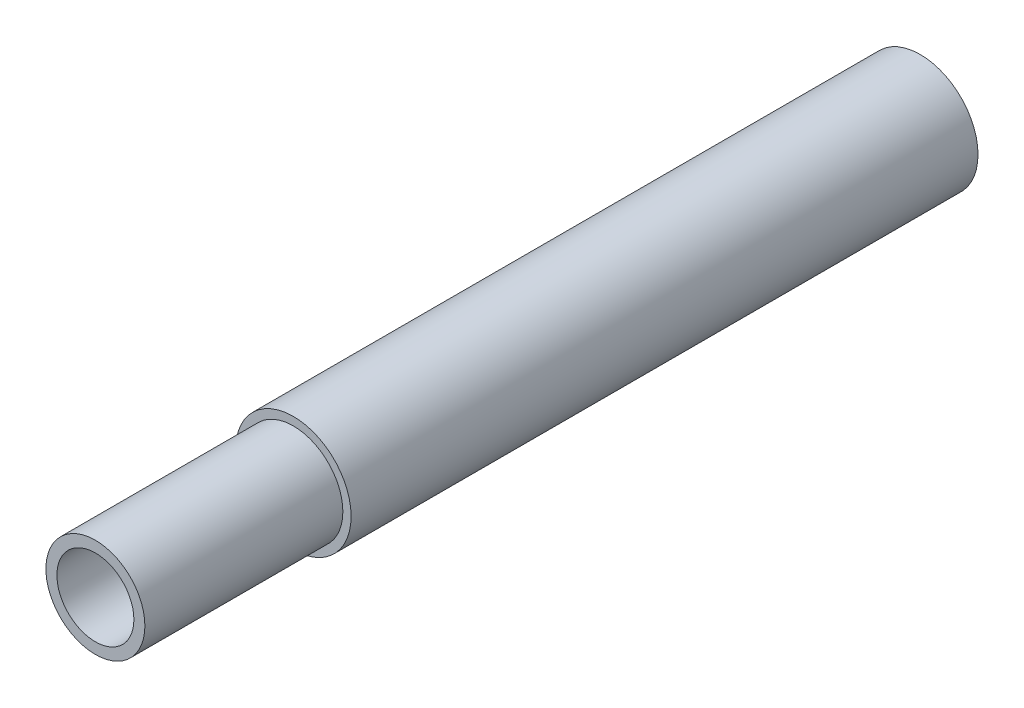
ISO-10303-21;
HEADER;
FILE_DESCRIPTION(('STEP AP214'),'2;1');
FILE_NAME('part.step','',(''),(''),'','','');
FILE_SCHEMA(('AUTOMOTIVE_DESIGN { 1 0 10303 214 1 1 1 1 }'));
ENDSEC;
DATA;
#1=APPLICATION_CONTEXT('core data for automotive mechanical design processes');
#2=APPLICATION_PROTOCOL_DEFINITION('international standard','automotive_design',2000,#1);
#3=PRODUCT_CONTEXT('',#1,'mechanical');
#4=PRODUCT('Part','Part','',(#3));
#5=PRODUCT_RELATED_PRODUCT_CATEGORY('part','',(#4));
#6=PRODUCT_DEFINITION_FORMATION('','',#4);
#7=PRODUCT_DEFINITION_CONTEXT('part definition',#1,'design');
#8=PRODUCT_DEFINITION('design','',#6,#7);
#9=PRODUCT_DEFINITION_SHAPE('','',#8);
#10=(LENGTH_UNIT() NAMED_UNIT(*) SI_UNIT(.MILLI.,.METRE.));
#11=(NAMED_UNIT(*) PLANE_ANGLE_UNIT() SI_UNIT($,.RADIAN.));
#12=(NAMED_UNIT(*) SI_UNIT($,.STERADIAN.) SOLID_ANGLE_UNIT());
#13=UNCERTAINTY_MEASURE_WITH_UNIT(LENGTH_MEASURE(1.E-05),#10,'distance_accuracy_value','');
#14=(GEOMETRIC_REPRESENTATION_CONTEXT(3) GLOBAL_UNCERTAINTY_ASSIGNED_CONTEXT((#13)) GLOBAL_UNIT_ASSIGNED_CONTEXT((#10,
#11,#12)) REPRESENTATION_CONTEXT('',''));
#15=CARTESIAN_POINT('',(0.,0.,0.));
#16=DIRECTION('',(0.,0.,1.));
#17=DIRECTION('',(1.,0.,0.));
#18=AXIS2_PLACEMENT_3D('',#15,#16,#17);
#19=CARTESIAN_POINT('',(0.,0.,-114.));
#20=DIRECTION('',(0.,0.,1.));
#21=DIRECTION('',(1.,0.,0.));
#22=AXIS2_PLACEMENT_3D('',#19,#20,#21);
#23=CYLINDRICAL_SURFACE('',#22,10.5);
#24=CARTESIAN_POINT('',(0.,0.,-114.));
#25=DIRECTION('',(0.,0.,1.));
#26=DIRECTION('',(1.,0.,0.));
#27=AXIS2_PLACEMENT_3D('',#24,#25,#26);
#28=CIRCLE('',#27,10.5);
#29=CARTESIAN_POINT('',(10.5,0.,-114.));
#30=VERTEX_POINT('',#29);
#31=EDGE_CURVE('E46',#30,#30,#28,.T.);
#32=CARTESIAN_POINT('',(0.,0.,0.));
#33=DIRECTION('',(0.,0.,1.));
#34=DIRECTION('',(1.,0.,0.));
#35=AXIS2_PLACEMENT_3D('',#32,#33,#34);
#36=CIRCLE('',#35,10.5);
#37=CARTESIAN_POINT('',(10.5,0.,0.));
#38=VERTEX_POINT('',#37);
#39=EDGE_CURVE('E45',#38,#38,#36,.T.);
#40=CARTESIAN_POINT('',(10.5,0.,-114.));
#41=CARTESIAN_POINT('',(10.5,0.,-112.8125));
#42=CARTESIAN_POINT('',(10.5,0.,-111.625));
#43=CARTESIAN_POINT('',(10.5,0.,-109.25));
#44=CARTESIAN_POINT('',(10.5,0.,-108.0625));
#45=CARTESIAN_POINT('',(10.5,0.,-105.6875));
#46=CARTESIAN_POINT('',(10.5,0.,-104.5));
#47=CARTESIAN_POINT('',(10.5,0.,-102.125));
#48=CARTESIAN_POINT('',(10.5,0.,-100.9375));
#49=CARTESIAN_POINT('',(10.5,0.,-98.5625));
#50=CARTESIAN_POINT('',(10.5,0.,-97.375));
#51=CARTESIAN_POINT('',(10.5,0.,-95.));
#52=CARTESIAN_POINT('',(10.5,0.,-93.8125));
#53=CARTESIAN_POINT('',(10.5,0.,-91.4375));
#54=CARTESIAN_POINT('',(10.5,0.,-90.25));
#55=CARTESIAN_POINT('',(10.5,0.,-87.875));
#56=CARTESIAN_POINT('',(10.5,0.,-86.6875));
#57=CARTESIAN_POINT('',(10.5,0.,-84.3125));
#58=CARTESIAN_POINT('',(10.5,0.,-83.125));
#59=CARTESIAN_POINT('',(10.5,0.,-80.75));
#60=CARTESIAN_POINT('',(10.5,0.,-79.5625));
#61=CARTESIAN_POINT('',(10.5,0.,-77.1875));
#62=CARTESIAN_POINT('',(10.5,0.,-76.));
#63=CARTESIAN_POINT('',(10.5,0.,-73.625));
#64=CARTESIAN_POINT('',(10.5,0.,-72.4375));
#65=CARTESIAN_POINT('',(10.5,0.,-70.0625));
#66=CARTESIAN_POINT('',(10.5,0.,-68.875));
#67=CARTESIAN_POINT('',(10.5,0.,-66.5));
#68=CARTESIAN_POINT('',(10.5,0.,-65.3125));
#69=CARTESIAN_POINT('',(10.5,0.,-62.9375));
#70=CARTESIAN_POINT('',(10.5,0.,-61.75));
#71=CARTESIAN_POINT('',(10.5,0.,-59.375));
#72=CARTESIAN_POINT('',(10.5,0.,-58.1875));
#73=CARTESIAN_POINT('',(10.5,0.,-55.8125));
#74=CARTESIAN_POINT('',(10.5,0.,-54.625));
#75=CARTESIAN_POINT('',(10.5,0.,-52.25));
#76=CARTESIAN_POINT('',(10.5,0.,-51.0625));
#77=CARTESIAN_POINT('',(10.5,0.,-48.6875));
#78=CARTESIAN_POINT('',(10.5,0.,-47.5));
#79=CARTESIAN_POINT('',(10.5,0.,-45.125));
#80=CARTESIAN_POINT('',(10.5,0.,-43.9375));
#81=CARTESIAN_POINT('',(10.5,0.,-41.5625));
#82=CARTESIAN_POINT('',(10.5,0.,-40.375));
#83=CARTESIAN_POINT('',(10.5,0.,-38.));
#84=CARTESIAN_POINT('',(10.5,0.,-36.8125));
#85=CARTESIAN_POINT('',(10.5,0.,-34.4375));
#86=CARTESIAN_POINT('',(10.5,0.,-33.25));
#87=CARTESIAN_POINT('',(10.5,0.,-30.875));
#88=CARTESIAN_POINT('',(10.5,0.,-29.6875));
#89=CARTESIAN_POINT('',(10.5,0.,-27.3125));
#90=CARTESIAN_POINT('',(10.5,0.,-26.125));
#91=CARTESIAN_POINT('',(10.5,0.,-23.75));
#92=CARTESIAN_POINT('',(10.5,0.,-22.5625));
#93=CARTESIAN_POINT('',(10.5,0.,-20.1875));
#94=CARTESIAN_POINT('',(10.5,0.,-19.));
#95=CARTESIAN_POINT('',(10.5,0.,-16.625));
#96=CARTESIAN_POINT('',(10.5,0.,-15.4375));
#97=CARTESIAN_POINT('',(10.5,0.,-13.0625));
#98=CARTESIAN_POINT('',(10.5,0.,-11.875));
#99=CARTESIAN_POINT('',(10.5,0.,-9.5));
#100=CARTESIAN_POINT('',(10.5,0.,-8.31250000000001));
#101=CARTESIAN_POINT('',(10.5,0.,-5.9375));
#102=CARTESIAN_POINT('',(10.5,0.,-4.75));
#103=CARTESIAN_POINT('',(10.5,0.,-2.375));
#104=CARTESIAN_POINT('',(10.5,0.,-1.1875));
#105=CARTESIAN_POINT('',(10.5,0.,0.));
#106=B_SPLINE_CURVE_WITH_KNOTS('',3,(#40,#41,#42,#43,#44,#45,#46,#47,#48,#49,#50,#51,#52,#53,
#54,#55,#56,#57,#58,#59,#60,#61,#62,#63,#64,#65,#66,#67,#68,#69,#70,#71,#72,#73,#74,#75,#76,#77,
#78,#79,#80,#81,#82,#83,#84,#85,#86,#87,#88,#89,#90,#91,#92,#93,#94,#95,#96,#97,#98,#99,#100,
#101,#102,#103,#104,#105),.UNSPECIFIED.,.F.,.F.,(4,2,2,2,2,2,2,2,2,2,2,2,2,2,2,2,2,2,2,2,2,2,2,
2,2,2,2,2,2,2,2,2,4),(0.,3.56250000000001,7.12500000000001,10.6875,14.25,17.8125,21.375,24.9375,
28.5,32.0625,35.625,39.1875,42.75,46.3125,49.875,53.4375,57.,60.5625,64.125,67.6875,71.25,
74.8125,78.375,81.9375,85.5,89.0625,92.625,96.1875,99.75,103.3125,106.875,110.4375,114.),.UNSPECIFIED.);
#107=EDGE_CURVE('BSEAM39',#30,#38,#106,.T.);
#108=ORIENTED_EDGE('',*,*,#31,.T.);
#109=ORIENTED_EDGE('',*,*,#39,.F.);
#110=ORIENTED_EDGE('',*,*,#107,.T.);
#111=ORIENTED_EDGE('',*,*,#107,.F.);
#112=EDGE_LOOP('',(#108,#110,#109,#111));
#113=FACE_BOUND('',#112,.T.);
#114=ADVANCED_FACE('F39',(#113),#23,.T.);
#115=CARTESIAN_POINT('',(0.,0.,-114.));
#116=DIRECTION('',(0.,0.,1.));
#117=DIRECTION('',(1.,0.,0.));
#118=AXIS2_PLACEMENT_3D('',#115,#116,#117);
#119=PLANE('',#118);
#120=CARTESIAN_POINT('',(0.,0.,-114.));
#121=DIRECTION('',(0.,0.,1.));
#122=DIRECTION('',(1.,0.,0.));
#123=AXIS2_PLACEMENT_3D('',#120,#121,#122);
#124=CIRCLE('',#123,7.);
#125=CARTESIAN_POINT('',(7.,0.,-114.));
#126=VERTEX_POINT('',#125);
#127=EDGE_CURVE('E54',#126,#126,#124,.T.);
#128=ORIENTED_EDGE('',*,*,#127,.T.);
#129=EDGE_LOOP('',(#128));
#130=FACE_BOUND('',#129,.T.);
#131=ORIENTED_EDGE('',*,*,#31,.F.);
#132=EDGE_LOOP('',(#131));
#133=FACE_BOUND('',#132,.T.);
#134=ADVANCED_FACE('F84',(#130,#133),#119,.F.);
#135=CARTESIAN_POINT('',(0.,0.,0.));
#136=DIRECTION('',(0.,0.,1.));
#137=DIRECTION('',(1.,0.,0.));
#138=AXIS2_PLACEMENT_3D('',#135,#136,#137);
#139=PLANE('',#138);
#140=CARTESIAN_POINT('',(0.,0.,0.));
#141=DIRECTION('',(0.,0.,1.));
#142=DIRECTION('',(1.,0.,0.));
#143=AXIS2_PLACEMENT_3D('',#140,#141,#142);
#144=CIRCLE('',#143,9.);
#145=CARTESIAN_POINT('',(9.,0.,0.));
#146=VERTEX_POINT('',#145);
#147=EDGE_CURVE('E10',#146,#146,#144,.T.);
#148=ORIENTED_EDGE('',*,*,#147,.F.);
#149=EDGE_LOOP('',(#148));
#150=FACE_BOUND('',#149,.T.);
#151=ORIENTED_EDGE('',*,*,#39,.T.);
#152=EDGE_LOOP('',(#151));
#153=FACE_BOUND('',#152,.T.);
#154=ADVANCED_FACE('F79',(#150,#153),#139,.T.);
#155=CARTESIAN_POINT('',(0.,0.,-114.));
#156=DIRECTION('',(0.,0.,1.));
#157=DIRECTION('',(1.,0.,0.));
#158=AXIS2_PLACEMENT_3D('',#155,#156,#157);
#159=CYLINDRICAL_SURFACE('',#158,7.);
#160=CARTESIAN_POINT('',(0.,0.,36.));
#161=DIRECTION('',(0.,0.,1.));
#162=DIRECTION('',(1.,0.,0.));
#163=AXIS2_PLACEMENT_3D('',#160,#161,#162);
#164=CIRCLE('',#163,7.);
#165=CARTESIAN_POINT('',(7.,0.,36.));
#166=VERTEX_POINT('',#165);
#167=EDGE_CURVE('E62',#166,#166,#164,.T.);
#168=CARTESIAN_POINT('',(7.,0.,-114.));
#169=CARTESIAN_POINT('',(7.,0.,-112.4375));
#170=CARTESIAN_POINT('',(7.,0.,-110.875));
#171=CARTESIAN_POINT('',(7.,0.,-107.75));
#172=CARTESIAN_POINT('',(7.,0.,-106.1875));
#173=CARTESIAN_POINT('',(7.,0.,-103.0625));
#174=CARTESIAN_POINT('',(7.,0.,-101.5));
#175=CARTESIAN_POINT('',(7.,0.,-98.375));
#176=CARTESIAN_POINT('',(7.,0.,-96.8125));
#177=CARTESIAN_POINT('',(7.,0.,-93.6875));
#178=CARTESIAN_POINT('',(7.,0.,-92.125));
#179=CARTESIAN_POINT('',(7.,0.,-89.));
#180=CARTESIAN_POINT('',(7.,0.,-87.4375));
#181=CARTESIAN_POINT('',(7.,0.,-84.3125));
#182=CARTESIAN_POINT('',(7.,0.,-82.75));
#183=CARTESIAN_POINT('',(7.,0.,-79.625));
#184=CARTESIAN_POINT('',(7.,0.,-78.0625));
#185=CARTESIAN_POINT('',(7.,0.,-74.9375));
#186=CARTESIAN_POINT('',(7.,0.,-73.375));
#187=CARTESIAN_POINT('',(7.,0.,-70.25));
#188=CARTESIAN_POINT('',(7.,0.,-68.6875));
#189=CARTESIAN_POINT('',(7.,0.,-65.5625));
#190=CARTESIAN_POINT('',(7.,0.,-64.));
#191=CARTESIAN_POINT('',(7.,0.,-60.875));
#192=CARTESIAN_POINT('',(7.,0.,-59.3125));
#193=CARTESIAN_POINT('',(7.,0.,-56.1875));
#194=CARTESIAN_POINT('',(7.,0.,-54.625));
#195=CARTESIAN_POINT('',(7.,0.,-51.5));
#196=CARTESIAN_POINT('',(7.,0.,-49.9375));
#197=CARTESIAN_POINT('',(7.,0.,-46.8125));
#198=CARTESIAN_POINT('',(7.,0.,-45.25));
#199=CARTESIAN_POINT('',(7.,0.,-42.125));
#200=CARTESIAN_POINT('',(7.,0.,-40.5625));
#201=CARTESIAN_POINT('',(7.,0.,-37.4375));
#202=CARTESIAN_POINT('',(7.,0.,-35.875));
#203=CARTESIAN_POINT('',(7.,0.,-32.75));
#204=CARTESIAN_POINT('',(7.,0.,-31.1875));
#205=CARTESIAN_POINT('',(7.,0.,-28.0625));
#206=CARTESIAN_POINT('',(7.,0.,-26.5));
#207=CARTESIAN_POINT('',(7.,0.,-23.375));
#208=CARTESIAN_POINT('',(7.,0.,-21.8125));
#209=CARTESIAN_POINT('',(7.,0.,-18.6875));
#210=CARTESIAN_POINT('',(7.,0.,-17.125));
#211=CARTESIAN_POINT('',(7.,0.,-14.));
#212=CARTESIAN_POINT('',(7.,0.,-12.4375));
#213=CARTESIAN_POINT('',(7.,0.,-9.3125));
#214=CARTESIAN_POINT('',(7.,0.,-7.75));
#215=CARTESIAN_POINT('',(7.,0.,-4.625));
#216=CARTESIAN_POINT('',(7.,0.,-3.0625));
#217=CARTESIAN_POINT('',(7.,0.,0.0624999999999977));
#218=CARTESIAN_POINT('',(7.,0.,1.625));
#219=CARTESIAN_POINT('',(7.,0.,4.74999999999999));
#220=CARTESIAN_POINT('',(7.,0.,6.31249999999999));
#221=CARTESIAN_POINT('',(7.,0.,9.43749999999999));
#222=CARTESIAN_POINT('',(7.,0.,11.));
#223=CARTESIAN_POINT('',(7.,0.,14.125));
#224=CARTESIAN_POINT('',(7.,0.,15.6875));
#225=CARTESIAN_POINT('',(7.,0.,18.8125));
#226=CARTESIAN_POINT('',(7.,0.,20.375));
#227=CARTESIAN_POINT('',(7.,0.,23.5));
#228=CARTESIAN_POINT('',(7.,0.,25.0625));
#229=CARTESIAN_POINT('',(7.,0.,28.1875));
#230=CARTESIAN_POINT('',(7.,0.,29.75));
#231=CARTESIAN_POINT('',(7.,0.,32.875));
#232=CARTESIAN_POINT('',(7.,0.,34.4375));
#233=CARTESIAN_POINT('',(7.,0.,36.));
#234=B_SPLINE_CURVE_WITH_KNOTS('',3,(#168,#169,#170,#171,#172,#173,#174,#175,#176,#177,#178,
#179,#180,#181,#182,#183,#184,#185,#186,#187,#188,#189,#190,#191,#192,#193,#194,#195,#196,#197,
#198,#199,#200,#201,#202,#203,#204,#205,#206,#207,#208,#209,#210,#211,#212,#213,#214,#215,#216,
#217,#218,#219,#220,#221,#222,#223,#224,#225,#226,#227,#228,#229,#230,#231,#232,#233),
.UNSPECIFIED.,.F.,.F.,(4,2,2,2,2,2,2,2,2,2,2,2,2,2,2,2,2,2,2,2,2,2,2,2,2,2,2,2,2,2,2,2,4),(0.,
4.6875,9.37499999999999,14.0625,18.75,23.4375,28.125,32.8125,37.5,42.1875,46.875,51.5625,56.25,
60.9375,65.625,70.3125,75.,79.6875,84.375,89.0625,93.75,98.4375,103.125,107.8125,112.5,117.1875,
121.875,126.5625,131.25,135.9375,140.625,145.3125,150.),.UNSPECIFIED.);
#235=EDGE_CURVE('BSEAM66',#126,#166,#234,.T.);
#236=ORIENTED_EDGE('',*,*,#127,.F.);
#237=ORIENTED_EDGE('',*,*,#167,.T.);
#238=ORIENTED_EDGE('',*,*,#235,.T.);
#239=ORIENTED_EDGE('',*,*,#235,.F.);
#240=EDGE_LOOP('',(#236,#238,#237,#239));
#241=FACE_BOUND('',#240,.T.);
#242=ADVANCED_FACE('F66',(#241),#159,.F.);
#243=CARTESIAN_POINT('',(0.,0.,36.));
#244=DIRECTION('',(0.,0.,1.));
#245=DIRECTION('',(1.,0.,0.));
#246=AXIS2_PLACEMENT_3D('',#243,#244,#245);
#247=PLANE('',#246);
#248=CARTESIAN_POINT('',(0.,0.,36.));
#249=DIRECTION('',(0.,0.,1.));
#250=DIRECTION('',(1.,0.,0.));
#251=AXIS2_PLACEMENT_3D('',#248,#249,#250);
#252=CIRCLE('',#251,9.);
#253=CARTESIAN_POINT('',(9.,0.,36.));
#254=VERTEX_POINT('',#253);
#255=EDGE_CURVE('E52',#254,#254,#252,.T.);
#256=ORIENTED_EDGE('',*,*,#255,.T.);
#257=EDGE_LOOP('',(#256));
#258=FACE_BOUND('',#257,.T.);
#259=ORIENTED_EDGE('',*,*,#167,.F.);
#260=EDGE_LOOP('',(#259));
#261=FACE_BOUND('',#260,.T.);
#262=ADVANCED_FACE('F68',(#258,#261),#247,.T.);
#263=CARTESIAN_POINT('',(0.,0.,36.));
#264=DIRECTION('',(0.,0.,-1.));
#265=DIRECTION('',(-1.,0.,0.));
#266=AXIS2_PLACEMENT_3D('',#263,#264,#265);
#267=CYLINDRICAL_SURFACE('',#266,9.);
#268=ORIENTED_EDGE('',*,*,#255,.F.);
#269=EDGE_LOOP('',(#268));
#270=FACE_BOUND('',#269,.T.);
#271=ORIENTED_EDGE('',*,*,#147,.T.);
#272=EDGE_LOOP('',(#271));
#273=FACE_BOUND('',#272,.T.);
#274=ADVANCED_FACE('F72',(#270,#273),#267,.T.);
#275=CLOSED_SHELL('',(#114,#134,#154,#242,#262,#274));
#276=MANIFOLD_SOLID_BREP('B2',#275);
#277=ADVANCED_BREP_SHAPE_REPRESENTATION('',(#18,#276),#14);
#278=SHAPE_DEFINITION_REPRESENTATION(#9,#277);
ENDSEC;
END-ISO-10303-21;
